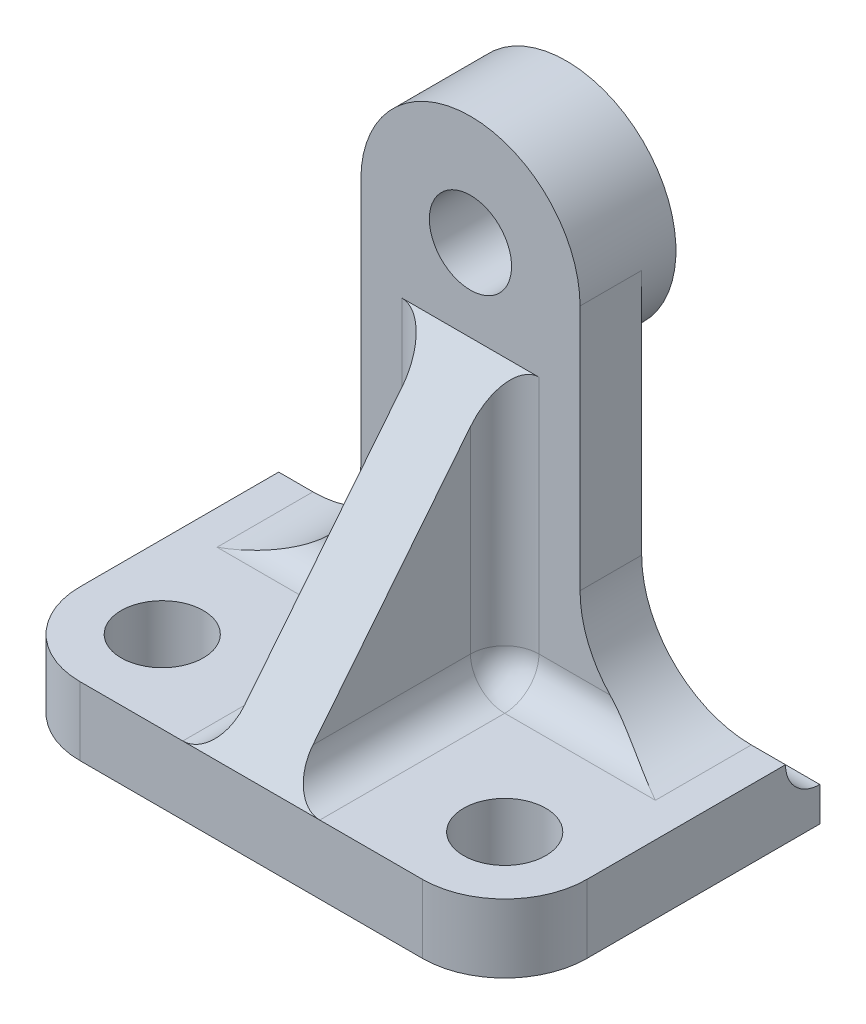
ISO-10303-21;
HEADER;
FILE_DESCRIPTION(('STEP AP214'),'2;1');
FILE_NAME('part.step','',(''),(''),'','','');
FILE_SCHEMA(('AUTOMOTIVE_DESIGN { 1 0 10303 214 1 1 1 1 }'));
ENDSEC;
DATA;
#1=APPLICATION_CONTEXT('core data for automotive mechanical design processes');
#2=APPLICATION_PROTOCOL_DEFINITION('international standard','automotive_design',2000,#1);
#3=PRODUCT_CONTEXT('',#1,'mechanical');
#4=PRODUCT('Part','Part','',(#3));
#5=PRODUCT_RELATED_PRODUCT_CATEGORY('part','',(#4));
#6=PRODUCT_DEFINITION_FORMATION('','',#4);
#7=PRODUCT_DEFINITION_CONTEXT('part definition',#1,'design');
#8=PRODUCT_DEFINITION('design','',#6,#7);
#9=PRODUCT_DEFINITION_SHAPE('','',#8);
#10=(LENGTH_UNIT() NAMED_UNIT(*) SI_UNIT(.MILLI.,.METRE.));
#11=(NAMED_UNIT(*) PLANE_ANGLE_UNIT() SI_UNIT($,.RADIAN.));
#12=(NAMED_UNIT(*) SI_UNIT($,.STERADIAN.) SOLID_ANGLE_UNIT());
#13=UNCERTAINTY_MEASURE_WITH_UNIT(LENGTH_MEASURE(1.E-05),#10,'distance_accuracy_value','');
#14=(GEOMETRIC_REPRESENTATION_CONTEXT(3) GLOBAL_UNCERTAINTY_ASSIGNED_CONTEXT((#13)) GLOBAL_UNIT_ASSIGNED_CONTEXT((#10,
#11,#12)) REPRESENTATION_CONTEXT('',''));
#15=CARTESIAN_POINT('',(0.,0.,0.));
#16=DIRECTION('',(0.,0.,1.));
#17=DIRECTION('',(1.,0.,0.));
#18=AXIS2_PLACEMENT_3D('',#15,#16,#17);
#19=CARTESIAN_POINT('',(-32.7821930509548,0.,46.));
#20=DIRECTION('',(0.,1.,0.));
#21=DIRECTION('',(0.,0.,1.));
#22=AXIS2_PLACEMENT_3D('',#19,#20,#21);
#23=PLANE('',#22);
#24=CARTESIAN_POINT('',(29.2178069490452,0.,34.));
#25=DIRECTION('',(0.,1.,0.));
#26=DIRECTION('',(0.,0.,1.));
#27=AXIS2_PLACEMENT_3D('',#24,#25,#26);
#28=CIRCLE('',#27,5.99999999999999);
#29=CARTESIAN_POINT('',(29.2178069490452,0.,40.));
#30=VERTEX_POINT('',#29);
#31=EDGE_CURVE('E445',#30,#30,#28,.T.);
#32=ORIENTED_EDGE('',*,*,#31,.F.);
#33=EDGE_LOOP('',(#32));
#34=FACE_BOUND('',#33,.T.);
#35=DIRECTION('',(1.,0.,0.));
#36=VECTOR('',#35,1.);
#37=CARTESIAN_POINT('',(-32.7821930509548,0.,19.));
#38=LINE('',#37,#36);
#39=CARTESIAN_POINT('',(36.2178069490452,0.,19.));
#40=VERTEX_POINT('',#39);
#41=CARTESIAN_POINT('',(14.2178069490452,0.,19.));
#42=VERTEX_POINT('',#41);
#43=EDGE_CURVE('E308',#40,#42,#38,.F.);
#44=ORIENTED_EDGE('',*,*,#43,.T.);
#45=DIRECTION('',(0.,0.,1.));
#46=VECTOR('',#45,1.);
#47=CARTESIAN_POINT('',(14.2178069490452,0.,46.));
#48=LINE('',#47,#46);
#49=CARTESIAN_POINT('',(14.2178069490452,0.,46.));
#50=VERTEX_POINT('',#49);
#51=EDGE_CURVE('E398',#42,#50,#48,.T.);
#52=ORIENTED_EDGE('',*,*,#51,.T.);
#53=DIRECTION('',(1.,0.,0.));
#54=VECTOR('',#53,1.);
#55=CARTESIAN_POINT('',(-32.7821930509548,0.,46.));
#56=LINE('',#55,#54);
#57=CARTESIAN_POINT('',(29.2178069490452,0.,46.));
#58=VERTEX_POINT('',#57);
#59=EDGE_CURVE('E242',#50,#58,#56,.T.);
#60=ORIENTED_EDGE('',*,*,#59,.T.);
#61=CARTESIAN_POINT('',(29.2178069490452,0.,34.));
#62=DIRECTION('',(0.,1.,0.));
#63=DIRECTION('',(0.,0.,1.));
#64=AXIS2_PLACEMENT_3D('',#61,#62,#63);
#65=CIRCLE('',#64,12.);
#66=CARTESIAN_POINT('',(41.2178069490452,0.,34.));
#67=VERTEX_POINT('',#66);
#68=EDGE_CURVE('E296',#58,#67,#65,.T.);
#69=ORIENTED_EDGE('',*,*,#68,.T.);
#70=DIRECTION('',(0.,0.,-1.));
#71=VECTOR('',#70,1.);
#72=CARTESIAN_POINT('',(41.2178069490452,0.,46.));
#73=LINE('',#72,#71);
#74=CARTESIAN_POINT('',(41.2178069490452,0.,5.));
#75=VERTEX_POINT('',#74);
#76=EDGE_CURVE('E259',#67,#75,#73,.T.);
#77=ORIENTED_EDGE('',*,*,#76,.T.);
#78=DIRECTION('',(1.,0.,0.));
#79=VECTOR('',#78,1.);
#80=CARTESIAN_POINT('',(-142.412252797358,0.,5.));
#81=LINE('',#80,#79);
#82=CARTESIAN_POINT('',(36.2178069490452,0.,5.));
#83=VERTEX_POINT('',#82);
#84=EDGE_CURVE('E217',#83,#75,#81,.T.);
#85=ORIENTED_EDGE('',*,*,#84,.F.);
#86=DIRECTION('',(0.,0.,-1.));
#87=VECTOR('',#86,1.);
#88=CARTESIAN_POINT('',(36.2178069490452,0.,46.));
#89=LINE('',#88,#87);
#90=EDGE_CURVE('E312',#83,#40,#89,.F.);
#91=ORIENTED_EDGE('',*,*,#90,.T.);
#92=EDGE_LOOP('',(#44,#52,#60,#69,#77,#85,#91));
#93=FACE_BOUND('',#92,.T.);
#94=ADVANCED_FACE('F41',(#34,#93),#23,.T.);
#95=CARTESIAN_POINT('',(4.21780694904517,5.,19.));
#96=DIRECTION('',(1.,0.,0.));
#97=DIRECTION('',(0.,0.,-1.));
#98=AXIS2_PLACEMENT_3D('',#95,#96,#97);
#99=CYLINDRICAL_SURFACE('',#98,5.);
#100=DIRECTION('',(1.,0.,0.));
#101=VECTOR('',#100,1.);
#102=CARTESIAN_POINT('',(4.21780694904517,5.,14.));
#103=LINE('',#102,#101);
#104=CARTESIAN_POINT('',(14.2178069490452,5.,14.));
#105=VERTEX_POINT('',#104);
#106=CARTESIAN_POINT('',(24.5988569104229,5.,14.));
#107=VERTEX_POINT('',#106);
#108=EDGE_CURVE('E302',#105,#107,#103,.T.);
#109=ORIENTED_EDGE('',*,*,#108,.F.);
#110=CARTESIAN_POINT('',(14.2178069490452,5.,19.));
#111=DIRECTION('',(1.,0.,0.));
#112=DIRECTION('',(0.,0.,-1.));
#113=AXIS2_PLACEMENT_3D('',#110,#111,#112);
#114=CIRCLE('',#113,5.);
#115=EDGE_CURVE('E386',#105,#42,#114,.F.);
#116=ORIENTED_EDGE('',*,*,#115,.T.);
#117=ORIENTED_EDGE('',*,*,#43,.F.);
#118=CARTESIAN_POINT('',(24.5988569104229,5.,14.));
#119=CARTESIAN_POINT('',(24.6917310787028,4.90189660748427,14.0000035097307));
#120=CARTESIAN_POINT('',(24.7858292298454,4.80499618840884,14.0028868310953));
#121=CARTESIAN_POINT('',(24.9762624928487,4.61378612585042,14.0140181578785));
#122=CARTESIAN_POINT('',(25.0725969605173,4.5194757529574,14.0222646364354));
#123=CARTESIAN_POINT('',(25.3643199415571,4.24100485407283,14.0544153954449));
#124=CARTESIAN_POINT('',(25.5628099715562,4.06090145153284,14.0857342825745));
#125=CARTESIAN_POINT('',(25.9646210211218,3.71415493918822,14.1649258150141));
#126=CARTESIAN_POINT('',(26.1678789594153,3.54740106207625,14.2126398246961));
#127=CARTESIAN_POINT('',(26.5800240909677,3.22574733836465,14.3222965845337));
#128=CARTESIAN_POINT('',(26.7889148570648,3.07085526666085,14.3842485624163));
#129=CARTESIAN_POINT('',(27.3121584244176,2.70206297959647,14.5527547305159));
#130=CARTESIAN_POINT('',(27.6292471366511,2.49529688313721,14.6664819973748));
#131=CARTESIAN_POINT('',(28.2710641457498,2.10791922760679,14.9148052945669));
#132=CARTESIAN_POINT('',(28.5957945486167,1.92731497907073,15.0494071363134));
#133=CARTESIAN_POINT('',(29.2530639091122,1.59064558487841,15.3359250189548));
#134=CARTESIAN_POINT('',(29.585638024757,1.43473415498917,15.4879400872668));
#135=CARTESIAN_POINT('',(30.25526963026,1.14803663063681,15.8049956680228));
#136=CARTESIAN_POINT('',(30.5923269650833,1.0172496697432,15.9700357310161));
#137=CARTESIAN_POINT('',(31.3635708148325,0.747251236742692,16.3572357864108));
#138=CARTESIAN_POINT('',(31.7988518219437,0.615704286066361,16.5825744577809));
#139=CARTESIAN_POINT('',(32.6733398710665,0.391007620732259,17.0446953555417));
#140=CARTESIAN_POINT('',(33.1125483119759,0.297872193612443,17.2814818035224));
#141=CARTESIAN_POINT('',(33.9919738042539,0.149323459884419,17.7615045543701));
#142=CARTESIAN_POINT('',(34.432183724722,0.0937962808305965,18.0047190490937));
#143=CARTESIAN_POINT('',(35.3135552460708,0.0194576790880034,18.4945302094291));
#144=CARTESIAN_POINT('',(35.7547160972101,0.000623747307564851,18.7411247080479));
#145=CARTESIAN_POINT('',(36.2030855921773,5.08166310800808E-06,18.9917705117728));
#146=CARTESIAN_POINT('',(36.2104462935697,2.44708063118757E-09,18.9958852689759));
#147=CARTESIAN_POINT('',(36.2178069490452,0.,19.));
#148=B_SPLINE_CURVE_WITH_KNOTS('',3,(#118,#119,#120,#121,#122,#123,#124,#125,#126,#127,#128,
#129,#130,#131,#132,#133,#134,#135,#136,#137,#138,#139,#140,#141,#142,#143,#144,#145,#146,#147),
.UNSPECIFIED.,.F.,.F.,(4,2,2,2,2,2,2,2,2,2,2,2,2,2,4),(0.,0.405180350888823,0.810245399599311,
1.61871587829457,2.41957433302391,3.22095330079766,4.40493796727036,5.58925284487019,
6.78067269806455,7.97205145714169,9.49275211319863,11.0140178995503,12.5306566665091,
14.0463647738528,14.0716629997255),.UNSPECIFIED.);
#149=EDGE_CURVE('E361',#40,#107,#148,.F.);
#150=ORIENTED_EDGE('',*,*,#149,.T.);
#151=EDGE_LOOP('',(#109,#116,#117,#150));
#152=FACE_BOUND('',#151,.T.);
#153=ADVANCED_FACE('F496',(#152),#99,.F.);
#154=CARTESIAN_POINT('',(-32.7821930509548,0.,46.));
#155=DIRECTION('',(1.,0.,0.));
#156=DIRECTION('',(0.,0.,-1.));
#157=AXIS2_PLACEMENT_3D('',#154,#155,#156);
#158=PLANE('',#157);
#159=DIRECTION('',(0.,0.,-1.));
#160=VECTOR('',#159,1.);
#161=CARTESIAN_POINT('',(-32.7821930509548,0.,46.));
#162=LINE('',#161,#160);
#163=CARTESIAN_POINT('',(-32.7821930509548,0.,34.));
#164=VERTEX_POINT('',#163);
#165=CARTESIAN_POINT('',(-32.7821930509548,0.,5.));
#166=VERTEX_POINT('',#165);
#167=EDGE_CURVE('E247',#164,#166,#162,.T.);
#168=ORIENTED_EDGE('',*,*,#167,.T.);
#169=CARTESIAN_POINT('',(-32.7821930509548,0.,0.));
#170=DIRECTION('',(1.,0.,0.));
#171=DIRECTION('',(0.,0.,-1.));
#172=AXIS2_PLACEMENT_3D('',#169,#170,#171);
#173=CIRCLE('',#172,5.);
#174=CARTESIAN_POINT('',(-32.7821930509548,-5.,0.));
#175=VERTEX_POINT('',#174);
#176=EDGE_CURVE('E234',#166,#175,#173,.T.);
#177=ORIENTED_EDGE('',*,*,#176,.T.);
#178=DIRECTION('',(0.,-1.,0.));
#179=VECTOR('',#178,1.);
#180=CARTESIAN_POINT('',(-32.7821930509548,0.,0.));
#181=LINE('',#180,#179);
#182=CARTESIAN_POINT('',(-32.7821930509548,-10.,0.));
#183=VERTEX_POINT('',#182);
#184=EDGE_CURVE('E238',#175,#183,#181,.T.);
#185=ORIENTED_EDGE('',*,*,#184,.T.);
#186=DIRECTION('',(0.,0.,-1.));
#187=VECTOR('',#186,1.);
#188=CARTESIAN_POINT('',(-32.7821930509548,-10.,46.));
#189=LINE('',#188,#187);
#190=CARTESIAN_POINT('',(-32.7821930509548,-10.,34.));
#191=VERTEX_POINT('',#190);
#192=EDGE_CURVE('E267',#191,#183,#189,.T.);
#193=ORIENTED_EDGE('',*,*,#192,.F.);
#194=DIRECTION('',(0.,-1.,0.));
#195=VECTOR('',#194,1.);
#196=CARTESIAN_POINT('',(-32.7821930509548,0.,34.));
#197=LINE('',#196,#195);
#198=EDGE_CURVE('E278',#191,#164,#197,.F.);
#199=ORIENTED_EDGE('',*,*,#198,.T.);
#200=EDGE_LOOP('',(#168,#177,#185,#193,#199));
#201=FACE_BOUND('',#200,.T.);
#202=ADVANCED_FACE('F503',(#201),#158,.F.);
#203=CARTESIAN_POINT('',(-32.7821930509548,-10.,46.));
#204=DIRECTION('',(0.,1.,0.));
#205=DIRECTION('',(0.,0.,1.));
#206=AXIS2_PLACEMENT_3D('',#203,#204,#205);
#207=PLANE('',#206);
#208=CARTESIAN_POINT('',(-20.7821930509548,-10.,34.));
#209=DIRECTION('',(0.,1.,0.));
#210=DIRECTION('',(0.,0.,1.));
#211=AXIS2_PLACEMENT_3D('',#208,#209,#210);
#212=CIRCLE('',#211,6.);
#213=CARTESIAN_POINT('',(-20.7821930509548,-10.,40.));
#214=VERTEX_POINT('',#213);
#215=EDGE_CURVE('E424',#214,#214,#212,.T.);
#216=ORIENTED_EDGE('',*,*,#215,.T.);
#217=EDGE_LOOP('',(#216));
#218=FACE_BOUND('',#217,.T.);
#219=CARTESIAN_POINT('',(29.2178069490452,-10.,34.));
#220=DIRECTION('',(0.,1.,0.));
#221=DIRECTION('',(0.,0.,1.));
#222=AXIS2_PLACEMENT_3D('',#219,#220,#221);
#223=CIRCLE('',#222,5.99999999999999);
#224=CARTESIAN_POINT('',(29.2178069490452,-10.,40.));
#225=VERTEX_POINT('',#224);
#226=EDGE_CURVE('E439',#225,#225,#223,.T.);
#227=ORIENTED_EDGE('',*,*,#226,.T.);
#228=EDGE_LOOP('',(#227));
#229=FACE_BOUND('',#228,.T.);
#230=DIRECTION('',(1.,0.,0.));
#231=VECTOR('',#230,1.);
#232=CARTESIAN_POINT('',(-32.7821930509548,-10.,0.));
#233=LINE('',#232,#231);
#234=CARTESIAN_POINT('',(41.2178069490452,-10.,0.));
#235=VERTEX_POINT('',#234);
#236=EDGE_CURVE('E250',#183,#235,#233,.T.);
#237=ORIENTED_EDGE('',*,*,#236,.T.);
#238=DIRECTION('',(0.,0.,-1.));
#239=VECTOR('',#238,1.);
#240=CARTESIAN_POINT('',(41.2178069490452,-10.,46.));
#241=LINE('',#240,#239);
#242=CARTESIAN_POINT('',(41.2178069490452,-10.,34.));
#243=VERTEX_POINT('',#242);
#244=EDGE_CURVE('E263',#243,#235,#241,.T.);
#245=ORIENTED_EDGE('',*,*,#244,.F.);
#246=CARTESIAN_POINT('',(29.2178069490452,-10.,34.));
#247=DIRECTION('',(0.,1.,0.));
#248=DIRECTION('',(0.,0.,1.));
#249=AXIS2_PLACEMENT_3D('',#246,#247,#248);
#250=CIRCLE('',#249,12.);
#251=CARTESIAN_POINT('',(29.2178069490452,-10.,46.));
#252=VERTEX_POINT('',#251);
#253=EDGE_CURVE('E288',#243,#252,#250,.F.);
#254=ORIENTED_EDGE('',*,*,#253,.T.);
#255=DIRECTION('',(1.,0.,0.));
#256=VECTOR('',#255,1.);
#257=CARTESIAN_POINT('',(-32.7821930509548,-10.,46.));
#258=LINE('',#257,#256);
#259=CARTESIAN_POINT('',(-20.7821930509548,-10.,46.));
#260=VERTEX_POINT('',#259);
#261=EDGE_CURVE('E239',#260,#252,#258,.T.);
#262=ORIENTED_EDGE('',*,*,#261,.F.);
#263=CARTESIAN_POINT('',(-20.7821930509548,-10.,34.));
#264=DIRECTION('',(0.,1.,0.));
#265=DIRECTION('',(0.,0.,1.));
#266=AXIS2_PLACEMENT_3D('',#263,#264,#265);
#267=CIRCLE('',#266,12.);
#268=EDGE_CURVE('E275',#260,#191,#267,.F.);
#269=ORIENTED_EDGE('',*,*,#268,.T.);
#270=ORIENTED_EDGE('',*,*,#192,.T.);
#271=EDGE_LOOP('',(#237,#245,#254,#262,#269,#270));
#272=FACE_BOUND('',#271,.T.);
#273=ADVANCED_FACE('F519',(#218,#229,#272),#207,.F.);
#274=CARTESIAN_POINT('',(41.2178069490452,0.,46.));
#275=DIRECTION('',(1.,0.,0.));
#276=DIRECTION('',(0.,1.,0.));
#277=AXIS2_PLACEMENT_3D('',#274,#275,#276);
#278=PLANE('',#277);
#279=CARTESIAN_POINT('',(41.2178069490452,0.,0.));
#280=DIRECTION('',(1.,0.,0.));
#281=DIRECTION('',(0.,1.,0.));
#282=AXIS2_PLACEMENT_3D('',#279,#280,#281);
#283=CIRCLE('',#282,5.);
#284=CARTESIAN_POINT('',(41.2178069490452,-5.,0.));
#285=VERTEX_POINT('',#284);
#286=EDGE_CURVE('E230',#75,#285,#283,.T.);
#287=ORIENTED_EDGE('',*,*,#286,.F.);
#288=ORIENTED_EDGE('',*,*,#76,.F.);
#289=DIRECTION('',(0.,-1.,0.));
#290=VECTOR('',#289,1.);
#291=CARTESIAN_POINT('',(41.2178069490452,0.,34.));
#292=LINE('',#291,#290);
#293=EDGE_CURVE('E284',#67,#243,#292,.T.);
#294=ORIENTED_EDGE('',*,*,#293,.T.);
#295=ORIENTED_EDGE('',*,*,#244,.T.);
#296=DIRECTION('',(0.,-1.,0.));
#297=VECTOR('',#296,1.);
#298=CARTESIAN_POINT('',(41.2178069490452,0.,0.));
#299=LINE('',#298,#297);
#300=EDGE_CURVE('E243',#285,#235,#299,.T.);
#301=ORIENTED_EDGE('',*,*,#300,.F.);
#302=EDGE_LOOP('',(#287,#288,#294,#295,#301));
#303=FACE_BOUND('',#302,.T.);
#304=ADVANCED_FACE('F511',(#303),#278,.T.);
#305=CARTESIAN_POINT('',(-20.7821930509548,0.,34.));
#306=DIRECTION('',(0.,1.,0.));
#307=DIRECTION('',(0.,0.,1.));
#308=AXIS2_PLACEMENT_3D('',#305,#306,#307);
#309=CIRCLE('',#308,6.);
#310=CARTESIAN_POINT('',(-20.7821930509548,0.,40.));
#311=VERTEX_POINT('',#310);
#312=EDGE_CURVE('E433',#311,#311,#309,.T.);
#313=ORIENTED_EDGE('',*,*,#312,.F.);
#314=EDGE_LOOP('',(#313));
#315=FACE_BOUND('',#314,.T.);
#316=CARTESIAN_POINT('',(-20.7821930509548,0.,46.));
#317=VERTEX_POINT('',#316);
#318=CARTESIAN_POINT('',(-5.78219305095481,0.,46.));
#319=VERTEX_POINT('',#318);
#320=EDGE_CURVE('E244',#317,#319,#56,.T.);
#321=ORIENTED_EDGE('',*,*,#320,.T.);
#322=DIRECTION('',(0.,0.,1.));
#323=VECTOR('',#322,1.);
#324=CARTESIAN_POINT('',(-5.78219305095481,0.,19.));
#325=LINE('',#324,#323);
#326=CARTESIAN_POINT('',(-5.78219305095481,0.,19.));
#327=VERTEX_POINT('',#326);
#328=EDGE_CURVE('E401',#319,#327,#325,.F.);
#329=ORIENTED_EDGE('',*,*,#328,.T.);
#330=CARTESIAN_POINT('',(-27.7821930509548,0.,19.));
#331=VERTEX_POINT('',#330);
#332=EDGE_CURVE('E307',#327,#331,#38,.F.);
#333=ORIENTED_EDGE('',*,*,#332,.T.);
#334=DIRECTION('',(0.,0.,-1.));
#335=VECTOR('',#334,1.);
#336=CARTESIAN_POINT('',(-27.7821930509548,0.,46.));
#337=LINE('',#336,#335);
#338=CARTESIAN_POINT('',(-27.7821930509548,0.,5.));
#339=VERTEX_POINT('',#338);
#340=EDGE_CURVE('E316',#331,#339,#337,.T.);
#341=ORIENTED_EDGE('',*,*,#340,.T.);
#342=EDGE_CURVE('E223',#166,#339,#81,.T.);
#343=ORIENTED_EDGE('',*,*,#342,.F.);
#344=ORIENTED_EDGE('',*,*,#167,.F.);
#345=CARTESIAN_POINT('',(-20.7821930509548,0.,34.));
#346=DIRECTION('',(0.,1.,0.));
#347=DIRECTION('',(0.,0.,1.));
#348=AXIS2_PLACEMENT_3D('',#345,#346,#347);
#349=CIRCLE('',#348,12.);
#350=EDGE_CURVE('E281',#164,#317,#349,.T.);
#351=ORIENTED_EDGE('',*,*,#350,.T.);
#352=EDGE_LOOP('',(#321,#329,#333,#341,#343,#344,#351));
#353=FACE_BOUND('',#352,.T.);
#354=ADVANCED_FACE('F499',(#315,#353),#23,.T.);
#355=CARTESIAN_POINT('',(0.,0.,46.));
#356=DIRECTION('',(0.,0.,1.));
#357=DIRECTION('',(1.,0.,0.));
#358=AXIS2_PLACEMENT_3D('',#355,#356,#357);
#359=PLANE('',#358);
#360=ORIENTED_EDGE('',*,*,#261,.T.);
#361=DIRECTION('',(0.,-1.,0.));
#362=VECTOR('',#361,1.);
#363=CARTESIAN_POINT('',(29.2178069490452,0.,46.));
#364=LINE('',#363,#362);
#365=EDGE_CURVE('E292',#252,#58,#364,.F.);
#366=ORIENTED_EDGE('',*,*,#365,.T.);
#367=ORIENTED_EDGE('',*,*,#59,.F.);
#368=DIRECTION('',(1.,0.,0.));
#369=VECTOR('',#368,1.);
#370=CARTESIAN_POINT('',(0.,0.,46.));
#371=LINE('',#370,#369);
#372=EDGE_CURVE('E59',#50,#319,#371,.F.);
#373=ORIENTED_EDGE('',*,*,#372,.T.);
#374=ORIENTED_EDGE('',*,*,#320,.F.);
#375=DIRECTION('',(0.,-1.,0.));
#376=VECTOR('',#375,1.);
#377=CARTESIAN_POINT('',(-20.7821930509548,-10.,46.));
#378=LINE('',#377,#376);
#379=EDGE_CURVE('E271',#317,#260,#378,.T.);
#380=ORIENTED_EDGE('',*,*,#379,.T.);
#381=EDGE_LOOP('',(#360,#366,#367,#373,#374,#380));
#382=FACE_BOUND('',#381,.T.);
#383=ADVANCED_FACE('F510',(#382),#359,.T.);
#384=CARTESIAN_POINT('',(0.,0.,0.));
#385=DIRECTION('',(0.,0.,1.));
#386=DIRECTION('',(1.,0.,0.));
#387=AXIS2_PLACEMENT_3D('',#384,#385,#386);
#388=PLANE('',#387);
#389=DIRECTION('',(1.,0.,0.));
#390=VECTOR('',#389,1.);
#391=CARTESIAN_POINT('',(-142.412252797358,-5.,0.));
#392=LINE('',#391,#390);
#393=EDGE_CURVE('E299',#175,#285,#392,.T.);
#394=ORIENTED_EDGE('',*,*,#393,.T.);
#395=ORIENTED_EDGE('',*,*,#300,.T.);
#396=ORIENTED_EDGE('',*,*,#236,.F.);
#397=ORIENTED_EDGE('',*,*,#184,.F.);
#398=EDGE_LOOP('',(#394,#395,#396,#397));
#399=FACE_BOUND('',#398,.T.);
#400=ADVANCED_FACE('F517',(#399),#388,.F.);
#401=CARTESIAN_POINT('',(-20.7821930509548,0.,34.));
#402=DIRECTION('',(0.,1.,0.));
#403=DIRECTION('',(0.,0.,1.));
#404=AXIS2_PLACEMENT_3D('',#401,#402,#403);
#405=CYLINDRICAL_SURFACE('',#404,12.);
#406=ORIENTED_EDGE('',*,*,#350,.F.);
#407=ORIENTED_EDGE('',*,*,#198,.F.);
#408=ORIENTED_EDGE('',*,*,#268,.F.);
#409=ORIENTED_EDGE('',*,*,#379,.F.);
#410=EDGE_LOOP('',(#406,#407,#408,#409));
#411=FACE_BOUND('',#410,.T.);
#412=ADVANCED_FACE('F556',(#411),#405,.T.);
#413=CARTESIAN_POINT('',(29.2178069490452,0.,34.));
#414=DIRECTION('',(0.,-1.,0.));
#415=DIRECTION('',(1.,0.,0.));
#416=AXIS2_PLACEMENT_3D('',#413,#414,#415);
#417=CYLINDRICAL_SURFACE('',#416,12.);
#418=ORIENTED_EDGE('',*,*,#68,.F.);
#419=ORIENTED_EDGE('',*,*,#365,.F.);
#420=ORIENTED_EDGE('',*,*,#253,.F.);
#421=ORIENTED_EDGE('',*,*,#293,.F.);
#422=EDGE_LOOP('',(#418,#419,#420,#421));
#423=FACE_BOUND('',#422,.T.);
#424=ADVANCED_FACE('F561',(#423),#417,.T.);
#425=CARTESIAN_POINT('',(-142.412252797358,0.,0.));
#426=DIRECTION('',(1.,0.,0.));
#427=DIRECTION('',(0.,0.,-1.));
#428=AXIS2_PLACEMENT_3D('',#425,#426,#427);
#429=CYLINDRICAL_SURFACE('',#428,5.);
#430=EDGE_CURVE('E221',#339,#83,#81,.T.);
#431=ORIENTED_EDGE('',*,*,#430,.T.);
#432=ORIENTED_EDGE('',*,*,#84,.T.);
#433=ORIENTED_EDGE('',*,*,#286,.T.);
#434=ORIENTED_EDGE('',*,*,#393,.F.);
#435=ORIENTED_EDGE('',*,*,#176,.F.);
#436=ORIENTED_EDGE('',*,*,#342,.T.);
#437=EDGE_LOOP('',(#431,#432,#433,#434,#435,#436));
#438=FACE_BOUND('',#437,.T.);
#439=ADVANCED_FACE('F490',(#438),#429,.F.);
#440=CARTESIAN_POINT('',(4.21780694904517,52.,14.));
#441=DIRECTION('',(0.,0.,-1.));
#442=DIRECTION('',(-1.,0.,0.));
#443=AXIS2_PLACEMENT_3D('',#440,#441,#442);
#444=PLANE('',#443);
#445=CARTESIAN_POINT('',(4.21780694904517,52.,14.));
#446=DIRECTION('',(0.,0.,-1.));
#447=DIRECTION('',(-1.,0.,0.));
#448=AXIS2_PLACEMENT_3D('',#445,#446,#447);
#449=CIRCLE('',#448,6.);
#450=CARTESIAN_POINT('',(-1.78219305095483,52.,14.));
#451=VERTEX_POINT('',#450);
#452=EDGE_CURVE('E210',#451,#451,#449,.T.);
#453=ORIENTED_EDGE('',*,*,#452,.T.);
#454=EDGE_LOOP('',(#453));
#455=FACE_BOUND('',#454,.T.);
#456=DIRECTION('',(-1.,0.,0.));
#457=VECTOR('',#456,1.);
#458=CARTESIAN_POINT('',(4.21780694904517,40.,14.));
#459=LINE('',#458,#457);
#460=CARTESIAN_POINT('',(-5.78219305095481,40.,14.));
#461=VERTEX_POINT('',#460);
#462=CARTESIAN_POINT('',(14.2178069490452,40.,14.));
#463=VERTEX_POINT('',#462);
#464=EDGE_CURVE('E453',#461,#463,#459,.F.);
#465=ORIENTED_EDGE('',*,*,#464,.T.);
#466=DIRECTION('',(0.,1.,0.));
#467=VECTOR('',#466,1.);
#468=CARTESIAN_POINT('',(14.2178069490452,5.,14.));
#469=LINE('',#468,#467);
#470=EDGE_CURVE('E383',#463,#105,#469,.F.);
#471=ORIENTED_EDGE('',*,*,#470,.T.);
#472=ORIENTED_EDGE('',*,*,#108,.T.);
#473=CARTESIAN_POINT('',(36.2178069490452,16.,14.));
#474=DIRECTION('',(0.,0.,-1.));
#475=DIRECTION('',(-1.,0.,0.));
#476=AXIS2_PLACEMENT_3D('',#473,#474,#475);
#477=CIRCLE('',#476,16.);
#478=CARTESIAN_POINT('',(20.2178069490452,16.,14.));
#479=VERTEX_POINT('',#478);
#480=EDGE_CURVE('E369',#107,#479,#477,.T.);
#481=ORIENTED_EDGE('',*,*,#480,.T.);
#482=DIRECTION('',(0.,1.,0.));
#483=VECTOR('',#482,1.);
#484=CARTESIAN_POINT('',(20.2178069490452,0.,14.));
#485=LINE('',#484,#483);
#486=CARTESIAN_POINT('',(20.2178069490452,52.,14.));
#487=VERTEX_POINT('',#486);
#488=EDGE_CURVE('E224',#479,#487,#485,.T.);
#489=ORIENTED_EDGE('',*,*,#488,.T.);
#490=CARTESIAN_POINT('',(4.21780694904517,52.,14.));
#491=DIRECTION('',(0.,0.,1.));
#492=DIRECTION('',(-1.,0.,0.));
#493=AXIS2_PLACEMENT_3D('',#490,#491,#492);
#494=CIRCLE('',#493,16.);
#495=CARTESIAN_POINT('',(-11.7821930509548,52.,14.));
#496=VERTEX_POINT('',#495);
#497=EDGE_CURVE('E470',#487,#496,#494,.T.);
#498=ORIENTED_EDGE('',*,*,#497,.T.);
#499=DIRECTION('',(0.,-1.,0.));
#500=VECTOR('',#499,1.);
#501=CARTESIAN_POINT('',(-11.7821930509548,0.,14.));
#502=LINE('',#501,#500);
#503=CARTESIAN_POINT('',(-11.7821930509548,16.,14.));
#504=VERTEX_POINT('',#503);
#505=EDGE_CURVE('E214',#496,#504,#502,.T.);
#506=ORIENTED_EDGE('',*,*,#505,.T.);
#507=CARTESIAN_POINT('',(-27.7821930509548,16.,14.));
#508=DIRECTION('',(0.,0.,-1.));
#509=DIRECTION('',(-1.,0.,0.));
#510=AXIS2_PLACEMENT_3D('',#507,#508,#509);
#511=CIRCLE('',#510,16.);
#512=CARTESIAN_POINT('',(-16.1632430123326,5.,14.));
#513=VERTEX_POINT('',#512);
#514=EDGE_CURVE('E329',#504,#513,#511,.T.);
#515=ORIENTED_EDGE('',*,*,#514,.T.);
#516=CARTESIAN_POINT('',(-5.78219305095481,5.,14.));
#517=VERTEX_POINT('',#516);
#518=EDGE_CURVE('E303',#513,#517,#103,.T.);
#519=ORIENTED_EDGE('',*,*,#518,.T.);
#520=DIRECTION('',(0.,1.,0.));
#521=VECTOR('',#520,1.);
#522=CARTESIAN_POINT('',(-5.78219305095481,52.,14.));
#523=LINE('',#522,#521);
#524=EDGE_CURVE('E379',#517,#461,#523,.T.);
#525=ORIENTED_EDGE('',*,*,#524,.T.);
#526=EDGE_LOOP('',(#465,#471,#472,#481,#489,#498,#506,#515,#519,#525));
#527=FACE_BOUND('',#526,.T.);
#528=ADVANCED_FACE('F482',(#455,#527),#444,.F.);
#529=CARTESIAN_POINT('',(4.21780694904517,52.,0.));
#530=DIRECTION('',(0.,0.,-1.));
#531=DIRECTION('',(-1.,0.,0.));
#532=AXIS2_PLACEMENT_3D('',#529,#530,#531);
#533=PLANE('',#532);
#534=CARTESIAN_POINT('',(4.21780694904517,52.,0.));
#535=DIRECTION('',(0.,0.,-1.));
#536=DIRECTION('',(-1.,0.,0.));
#537=AXIS2_PLACEMENT_3D('',#534,#535,#536);
#538=CIRCLE('',#537,6.);
#539=CARTESIAN_POINT('',(-1.78219305095483,52.,0.));
#540=VERTEX_POINT('',#539);
#541=EDGE_CURVE('E461',#540,#540,#538,.T.);
#542=ORIENTED_EDGE('',*,*,#541,.F.);
#543=EDGE_LOOP('',(#542));
#544=FACE_BOUND('',#543,.T.);
#545=CARTESIAN_POINT('',(4.21780694904517,52.,0.));
#546=DIRECTION('',(0.,0.,1.));
#547=DIRECTION('',(-1.,0.,0.));
#548=AXIS2_PLACEMENT_3D('',#545,#546,#547);
#549=CIRCLE('',#548,16.);
#550=CARTESIAN_POINT('',(-11.7821930509548,52.,0.));
#551=VERTEX_POINT('',#550);
#552=EDGE_CURVE('E197',#551,#551,#549,.T.);
#553=ORIENTED_EDGE('',*,*,#552,.F.);
#554=EDGE_LOOP('',(#553));
#555=FACE_BOUND('',#554,.T.);
#556=ADVANCED_FACE('F480',(#544,#555),#533,.T.);
#557=CARTESIAN_POINT('',(4.21780694904517,52.,14.));
#558=DIRECTION('',(0.,0.,-1.));
#559=DIRECTION('',(-1.,0.,0.));
#560=AXIS2_PLACEMENT_3D('',#557,#558,#559);
#561=CYLINDRICAL_SURFACE('',#560,16.);
#562=DIRECTION('',(0.,0.,-1.));
#563=VECTOR('',#562,1.);
#564=CARTESIAN_POINT('',(20.2178069490452,52.,14.));
#565=LINE('',#564,#563);
#566=CARTESIAN_POINT('',(20.2178069490452,52.,5.));
#567=VERTEX_POINT('',#566);
#568=EDGE_CURVE('E208',#487,#567,#565,.T.);
#569=ORIENTED_EDGE('',*,*,#568,.T.);
#570=CARTESIAN_POINT('',(4.21780694904517,52.,5.));
#571=DIRECTION('',(0.,0.,1.));
#572=DIRECTION('',(0.,-1.,0.));
#573=AXIS2_PLACEMENT_3D('',#570,#571,#572);
#574=CIRCLE('',#573,16.);
#575=CARTESIAN_POINT('',(-11.7821930509548,52.,5.));
#576=VERTEX_POINT('',#575);
#577=EDGE_CURVE('E189',#576,#567,#574,.T.);
#578=ORIENTED_EDGE('',*,*,#577,.F.);
#579=DIRECTION('',(0.,0.,-1.));
#580=VECTOR('',#579,1.);
#581=CARTESIAN_POINT('',(-11.7821930509548,52.,14.));
#582=LINE('',#581,#580);
#583=EDGE_CURVE('E206',#496,#576,#582,.T.);
#584=ORIENTED_EDGE('',*,*,#583,.F.);
#585=ORIENTED_EDGE('',*,*,#497,.F.);
#586=EDGE_LOOP('',(#569,#578,#584,#585));
#587=FACE_BOUND('',#586,.T.);
#588=ORIENTED_EDGE('',*,*,#552,.T.);
#589=EDGE_LOOP('',(#588));
#590=FACE_BOUND('',#589,.T.);
#591=ADVANCED_FACE('F203',(#587,#590),#561,.T.);
#592=CARTESIAN_POINT('',(-11.7821930509548,0.,14.));
#593=DIRECTION('',(1.,0.,0.));
#594=DIRECTION('',(0.,0.,-1.));
#595=AXIS2_PLACEMENT_3D('',#592,#593,#594);
#596=PLANE('',#595);
#597=DIRECTION('',(0.,1.,0.));
#598=VECTOR('',#597,1.);
#599=CARTESIAN_POINT('',(-11.7821930509548,52.,5.));
#600=LINE('',#599,#598);
#601=CARTESIAN_POINT('',(-11.7821930509548,16.,5.));
#602=VERTEX_POINT('',#601);
#603=EDGE_CURVE('E185',#602,#576,#600,.T.);
#604=ORIENTED_EDGE('',*,*,#603,.F.);
#605=DIRECTION('',(0.,0.,-1.));
#606=VECTOR('',#605,1.);
#607=CARTESIAN_POINT('',(-11.7821930509548,16.,14.));
#608=LINE('',#607,#606);
#609=EDGE_CURVE('E320',#602,#504,#608,.F.);
#610=ORIENTED_EDGE('',*,*,#609,.T.);
#611=ORIENTED_EDGE('',*,*,#505,.F.);
#612=ORIENTED_EDGE('',*,*,#583,.T.);
#613=EDGE_LOOP('',(#604,#610,#611,#612));
#614=FACE_BOUND('',#613,.T.);
#615=ADVANCED_FACE('F212',(#614),#596,.F.);
#616=CARTESIAN_POINT('',(20.2178069490452,0.,14.));
#617=DIRECTION('',(-1.,0.,0.));
#618=DIRECTION('',(0.,0.,1.));
#619=AXIS2_PLACEMENT_3D('',#616,#617,#618);
#620=PLANE('',#619);
#621=ORIENTED_EDGE('',*,*,#488,.F.);
#622=DIRECTION('',(0.,0.,-1.));
#623=VECTOR('',#622,1.);
#624=CARTESIAN_POINT('',(20.2178069490452,16.,14.));
#625=LINE('',#624,#623);
#626=CARTESIAN_POINT('',(20.2178069490452,16.,5.));
#627=VERTEX_POINT('',#626);
#628=EDGE_CURVE('E323',#479,#627,#625,.T.);
#629=ORIENTED_EDGE('',*,*,#628,.T.);
#630=DIRECTION('',(0.,-1.,0.));
#631=VECTOR('',#630,1.);
#632=CARTESIAN_POINT('',(20.2178069490452,52.,5.));
#633=LINE('',#632,#631);
#634=EDGE_CURVE('E198',#567,#627,#633,.T.);
#635=ORIENTED_EDGE('',*,*,#634,.F.);
#636=ORIENTED_EDGE('',*,*,#568,.F.);
#637=EDGE_LOOP('',(#621,#629,#635,#636));
#638=FACE_BOUND('',#637,.T.);
#639=ADVANCED_FACE('F596',(#638),#620,.F.);
#640=CARTESIAN_POINT('',(41.2188069490452,52.,5.));
#641=DIRECTION('',(0.,0.,1.));
#642=DIRECTION('',(0.,-1.,0.));
#643=AXIS2_PLACEMENT_3D('',#640,#641,#642);
#644=PLANE('',#643);
#645=ORIENTED_EDGE('',*,*,#577,.T.);
#646=ORIENTED_EDGE('',*,*,#634,.T.);
#647=CARTESIAN_POINT('',(36.2178069490452,16.,5.));
#648=DIRECTION('',(0.,0.,1.));
#649=DIRECTION('',(0.,-1.,0.));
#650=AXIS2_PLACEMENT_3D('',#647,#648,#649);
#651=CIRCLE('',#650,16.);
#652=EDGE_CURVE('E343',#627,#83,#651,.T.);
#653=ORIENTED_EDGE('',*,*,#652,.T.);
#654=ORIENTED_EDGE('',*,*,#430,.F.);
#655=CARTESIAN_POINT('',(-27.7821930509548,16.,5.));
#656=DIRECTION('',(0.,0.,1.));
#657=DIRECTION('',(0.,-1.,0.));
#658=AXIS2_PLACEMENT_3D('',#655,#656,#657);
#659=CIRCLE('',#658,16.);
#660=EDGE_CURVE('E192',#339,#602,#659,.T.);
#661=ORIENTED_EDGE('',*,*,#660,.T.);
#662=ORIENTED_EDGE('',*,*,#603,.T.);
#663=EDGE_LOOP('',(#645,#646,#653,#654,#661,#662));
#664=FACE_BOUND('',#663,.T.);
#665=ADVANCED_FACE('F187',(#664),#644,.F.);
#666=ORIENTED_EDGE('',*,*,#332,.F.);
#667=CARTESIAN_POINT('',(-5.78219305095481,5.,19.));
#668=DIRECTION('',(1.,0.,0.));
#669=DIRECTION('',(0.,0.,-1.));
#670=AXIS2_PLACEMENT_3D('',#667,#668,#669);
#671=CIRCLE('',#670,5.);
#672=EDGE_CURVE('E395',#327,#517,#671,.T.);
#673=ORIENTED_EDGE('',*,*,#672,.T.);
#674=ORIENTED_EDGE('',*,*,#518,.F.);
#675=CARTESIAN_POINT('',(-16.1632430123326,5.,14.));
#676=CARTESIAN_POINT('',(-16.2561171806124,4.90189660748432,14.0000035097307));
#677=CARTESIAN_POINT('',(-16.350215331755,4.80499618840893,14.0028868310953));
#678=CARTESIAN_POINT('',(-16.5406485947582,4.61378612585061,14.0140181578785));
#679=CARTESIAN_POINT('',(-16.6369830624267,4.51947575295763,14.0222646364354));
#680=CARTESIAN_POINT('',(-16.9287060434664,4.24100485407318,14.0544153954449));
#681=CARTESIAN_POINT('',(-17.1271960734654,4.06090145153328,14.0857342825744));
#682=CARTESIAN_POINT('',(-17.529007123031,3.71415493918864,14.164925815014));
#683=CARTESIAN_POINT('',(-17.7322650613245,3.54740106207659,14.212639824696));
#684=CARTESIAN_POINT('',(-18.1444101928772,3.22574733836481,14.3222965845337));
#685=CARTESIAN_POINT('',(-18.3533009589744,3.07085526666093,14.3842485624163));
#686=CARTESIAN_POINT('',(-18.8765445263273,2.70206297959642,14.5527547305159));
#687=CARTESIAN_POINT('',(-19.1936332385609,2.49529688313711,14.6664819973749));
#688=CARTESIAN_POINT('',(-19.8354502476598,2.10791922760661,14.9148052945671));
#689=CARTESIAN_POINT('',(-20.1601806505267,1.92731497907051,15.0494071363136));
#690=CARTESIAN_POINT('',(-20.8174500110223,1.59064558487822,15.3359250189549));
#691=CARTESIAN_POINT('',(-21.150024126667,1.43473415498903,15.4879400872669));
#692=CARTESIAN_POINT('',(-21.8196557321698,1.14803663063675,15.8049956680229));
#693=CARTESIAN_POINT('',(-22.1567130669931,1.01724966974317,15.9700357310162));
#694=CARTESIAN_POINT('',(-22.9279569167422,0.747251236742695,16.3572357864107));
#695=CARTESIAN_POINT('',(-23.3632379238535,0.615704286066367,16.5825744577807));
#696=CARTESIAN_POINT('',(-24.2377259729759,0.391007620732282,17.0446953555419));
#697=CARTESIAN_POINT('',(-24.6769344138848,0.297872193612475,17.2814818035233));
#698=CARTESIAN_POINT('',(-25.556359906164,0.149323459884447,17.761504554369));
#699=CARTESIAN_POINT('',(-25.9965698266336,0.0937962808306168,18.0047190490899));
#700=CARTESIAN_POINT('',(-26.8779413479783,0.0194576790879975,18.4945302094329));
#701=CARTESIAN_POINT('',(-27.3191021991119,0.000623747307541425,18.741124708062));
#702=CARTESIAN_POINT('',(-27.7674716940867,5.08166310724744E-06,18.9917705117733));
#703=CARTESIAN_POINT('',(-27.7748323954793,2.44708025347607E-09,18.9958852689761));
#704=CARTESIAN_POINT('',(-27.7821930509548,0.,19.));
#705=B_SPLINE_CURVE_WITH_KNOTS('',3,(#675,#676,#677,#678,#679,#680,#681,#682,#683,#684,#685,
#686,#687,#688,#689,#690,#691,#692,#693,#694,#695,#696,#697,#698,#699,#700,#701,#702,#703,#704),
.UNSPECIFIED.,.F.,.F.,(4,2,2,2,2,2,2,2,2,2,2,2,2,2,4),(0.,0.405180350888628,0.810245399598923,
1.61871587829376,2.4195743330235,3.22095330079766,4.40493796727067,5.58925284487077,
6.7806726980648,7.9720514571417,9.4927521131986,11.01401789955,12.530656666509,14.0463647738529,
14.0716629997255),.UNSPECIFIED.);
#706=EDGE_CURVE('E333',#513,#331,#705,.T.);
#707=ORIENTED_EDGE('',*,*,#706,.T.);
#708=EDGE_LOOP('',(#666,#673,#674,#707));
#709=FACE_BOUND('',#708,.T.);
#710=ADVANCED_FACE('F345',(#709),#99,.F.);
#711=CARTESIAN_POINT('',(-27.7821930509548,16.,46.));
#712=DIRECTION('',(0.,0.,-1.));
#713=DIRECTION('',(-1.,0.,0.));
#714=AXIS2_PLACEMENT_3D('',#711,#712,#713);
#715=CYLINDRICAL_SURFACE('',#714,16.);
#716=ORIENTED_EDGE('',*,*,#514,.F.);
#717=ORIENTED_EDGE('',*,*,#609,.F.);
#718=ORIENTED_EDGE('',*,*,#660,.F.);
#719=ORIENTED_EDGE('',*,*,#340,.F.);
#720=ORIENTED_EDGE('',*,*,#706,.F.);
#721=EDGE_LOOP('',(#716,#717,#718,#719,#720));
#722=FACE_BOUND('',#721,.T.);
#723=ADVANCED_FACE('F348',(#722),#715,.F.);
#724=CARTESIAN_POINT('',(36.2178069490452,16.,14.));
#725=DIRECTION('',(0.,0.,-1.));
#726=DIRECTION('',(-1.,0.,0.));
#727=AXIS2_PLACEMENT_3D('',#724,#725,#726);
#728=CYLINDRICAL_SURFACE('',#727,16.);
#729=ORIENTED_EDGE('',*,*,#149,.F.);
#730=ORIENTED_EDGE('',*,*,#90,.F.);
#731=ORIENTED_EDGE('',*,*,#652,.F.);
#732=ORIENTED_EDGE('',*,*,#628,.F.);
#733=ORIENTED_EDGE('',*,*,#480,.F.);
#734=EDGE_LOOP('',(#729,#730,#731,#732,#733));
#735=FACE_BOUND('',#734,.T.);
#736=ADVANCED_FACE('F352',(#735),#728,.F.);
#737=CARTESIAN_POINT('',(4.21780694904517,52.,46.));
#738=DIRECTION('',(0.,0.,-1.));
#739=DIRECTION('',(-1.,0.,0.));
#740=AXIS2_PLACEMENT_3D('',#737,#738,#739);
#741=CYLINDRICAL_SURFACE('',#740,6.);
#742=ORIENTED_EDGE('',*,*,#541,.T.);
#743=EDGE_LOOP('',(#742));
#744=FACE_BOUND('',#743,.T.);
#745=ORIENTED_EDGE('',*,*,#452,.F.);
#746=EDGE_LOOP('',(#745));
#747=FACE_BOUND('',#746,.T.);
#748=ADVANCED_FACE('F357',(#744,#747),#741,.F.);
#749=CARTESIAN_POINT('',(4.21780694904517,40.,14.));
#750=DIRECTION('',(0.,-0.624695047554424,-0.78086880944303));
#751=DIRECTION('',(0.,-0.78086880944303,0.624695047554424));
#752=AXIS2_PLACEMENT_3D('',#749,#750,#751);
#753=PLANE('',#752);
#754=ORIENTED_EDGE('',*,*,#372,.F.);
#755=CARTESIAN_POINT('',(14.2178069490452,5.,42.));
#756=DIRECTION('',(0.,-0.624695047554424,-0.78086880944303));
#757=DIRECTION('',(0.,-0.78086880944303,0.624695047554424));
#758=AXIS2_PLACEMENT_3D('',#755,#756,#757);
#759=ELLIPSE('',#758,6.40312423743285,5.);
#760=CARTESIAN_POINT('',(9.21780694904516,5.,42.));
#761=VERTEX_POINT('',#760);
#762=EDGE_CURVE('E51',#50,#761,#759,.T.);
#763=ORIENTED_EDGE('',*,*,#762,.T.);
#764=DIRECTION('',(0.,-0.78086880944303,0.624695047554424));
#765=VECTOR('',#764,1.);
#766=CARTESIAN_POINT('',(9.21780694904516,40.,14.));
#767=LINE('',#766,#765);
#768=CARTESIAN_POINT('',(9.21780694904516,33.75,19.));
#769=VERTEX_POINT('',#768);
#770=EDGE_CURVE('E420',#769,#761,#767,.T.);
#771=ORIENTED_EDGE('',*,*,#770,.F.);
#772=CARTESIAN_POINT('',(14.2178069490452,33.75,19.));
#773=DIRECTION('',(0.,-0.624695047554424,-0.78086880944303));
#774=DIRECTION('',(0.,-0.78086880944303,0.624695047554424));
#775=AXIS2_PLACEMENT_3D('',#772,#773,#774);
#776=ELLIPSE('',#775,8.00390529679106,5.);
#777=EDGE_CURVE('E404',#769,#463,#776,.T.);
#778=ORIENTED_EDGE('',*,*,#777,.T.);
#779=ORIENTED_EDGE('',*,*,#464,.F.);
#780=CARTESIAN_POINT('',(-5.78219305095481,33.75,19.));
#781=DIRECTION('',(0.,-0.624695047554424,-0.78086880944303));
#782=DIRECTION('',(0.,0.78086880944303,-0.624695047554424));
#783=AXIS2_PLACEMENT_3D('',#780,#781,#782);
#784=ELLIPSE('',#783,8.00390529679106,5.);
#785=CARTESIAN_POINT('',(-0.782193050954811,33.75,19.));
#786=VERTEX_POINT('',#785);
#787=EDGE_CURVE('E408',#461,#786,#784,.T.);
#788=ORIENTED_EDGE('',*,*,#787,.T.);
#789=DIRECTION('',(0.,-0.78086880944303,0.624695047554424));
#790=VECTOR('',#789,1.);
#791=CARTESIAN_POINT('',(-0.782193050954811,40.,14.));
#792=LINE('',#791,#790);
#793=CARTESIAN_POINT('',(-0.782193050954811,5.,42.));
#794=VERTEX_POINT('',#793);
#795=EDGE_CURVE('E449',#786,#794,#792,.T.);
#796=ORIENTED_EDGE('',*,*,#795,.T.);
#797=CARTESIAN_POINT('',(-5.78219305095481,5.,42.));
#798=DIRECTION('',(0.,-0.624695047554424,-0.78086880944303));
#799=DIRECTION('',(0.,0.78086880944303,-0.624695047554424));
#800=AXIS2_PLACEMENT_3D('',#797,#798,#799);
#801=ELLIPSE('',#800,6.40312423743285,5.);
#802=EDGE_CURVE('E11',#794,#319,#801,.T.);
#803=ORIENTED_EDGE('',*,*,#802,.T.);
#804=EDGE_LOOP('',(#754,#763,#771,#778,#779,#788,#796,#803));
#805=FACE_BOUND('',#804,.T.);
#806=ADVANCED_FACE('F529',(#805),#753,.F.);
#807=CARTESIAN_POINT('',(-0.782193050954811,29.,23.));
#808=DIRECTION('',(-1.,0.,0.));
#809=DIRECTION('',(0.,0.,1.));
#810=AXIS2_PLACEMENT_3D('',#807,#808,#809);
#811=PLANE('',#810);
#812=ORIENTED_EDGE('',*,*,#795,.F.);
#813=DIRECTION('',(0.,1.,0.));
#814=VECTOR('',#813,1.);
#815=CARTESIAN_POINT('',(-0.782193050954811,29.,19.));
#816=LINE('',#815,#814);
#817=CARTESIAN_POINT('',(-0.782193050954811,5.,19.));
#818=VERTEX_POINT('',#817);
#819=EDGE_CURVE('E392',#786,#818,#816,.F.);
#820=ORIENTED_EDGE('',*,*,#819,.T.);
#821=DIRECTION('',(0.,0.,1.));
#822=VECTOR('',#821,1.);
#823=CARTESIAN_POINT('',(-0.782193050954811,5.,46.));
#824=LINE('',#823,#822);
#825=EDGE_CURVE('E389',#818,#794,#824,.T.);
#826=ORIENTED_EDGE('',*,*,#825,.T.);
#827=EDGE_LOOP('',(#812,#820,#826));
#828=FACE_BOUND('',#827,.T.);
#829=ADVANCED_FACE('F579',(#828),#811,.T.);
#830=CARTESIAN_POINT('',(9.21780694904516,29.,23.));
#831=DIRECTION('',(-1.,0.,0.));
#832=DIRECTION('',(0.,0.,1.));
#833=AXIS2_PLACEMENT_3D('',#830,#831,#832);
#834=PLANE('',#833);
#835=DIRECTION('',(0.,0.,1.));
#836=VECTOR('',#835,1.);
#837=CARTESIAN_POINT('',(9.21780694904516,5.,23.));
#838=LINE('',#837,#836);
#839=CARTESIAN_POINT('',(9.21780694904516,5.,19.));
#840=VERTEX_POINT('',#839);
#841=EDGE_CURVE('E372',#761,#840,#838,.F.);
#842=ORIENTED_EDGE('',*,*,#841,.T.);
#843=DIRECTION('',(0.,1.,0.));
#844=VECTOR('',#843,1.);
#845=CARTESIAN_POINT('',(9.21780694904516,40.,19.));
#846=LINE('',#845,#844);
#847=EDGE_CURVE('E375',#840,#769,#846,.T.);
#848=ORIENTED_EDGE('',*,*,#847,.T.);
#849=ORIENTED_EDGE('',*,*,#770,.T.);
#850=EDGE_LOOP('',(#842,#848,#849));
#851=FACE_BOUND('',#850,.T.);
#852=ADVANCED_FACE('F571',(#851),#834,.F.);
#853=CARTESIAN_POINT('',(14.2178069490452,5.,46.));
#854=DIRECTION('',(0.,0.,1.));
#855=DIRECTION('',(1.,0.,0.));
#856=AXIS2_PLACEMENT_3D('',#853,#854,#855);
#857=CYLINDRICAL_SURFACE('',#856,5.);
#858=ORIENTED_EDGE('',*,*,#762,.F.);
#859=ORIENTED_EDGE('',*,*,#51,.F.);
#860=CARTESIAN_POINT('',(14.2178069490452,5.,19.));
#861=DIRECTION('',(0.,0.,1.));
#862=DIRECTION('',(1.,0.,0.));
#863=AXIS2_PLACEMENT_3D('',#860,#861,#862);
#864=CIRCLE('',#863,5.);
#865=EDGE_CURVE('E417',#840,#42,#864,.T.);
#866=ORIENTED_EDGE('',*,*,#865,.F.);
#867=ORIENTED_EDGE('',*,*,#841,.F.);
#868=EDGE_LOOP('',(#858,#859,#866,#867));
#869=FACE_BOUND('',#868,.T.);
#870=ADVANCED_FACE('F567',(#869),#857,.F.);
#871=CARTESIAN_POINT('',(14.2178069490452,5.,19.));
#872=DIRECTION('',(-1.,0.,0.));
#873=DIRECTION('',(0.,0.,1.));
#874=AXIS2_PLACEMENT_3D('',#871,#872,#873);
#875=SPHERICAL_SURFACE('',#874,5.);
#876=ORIENTED_EDGE('',*,*,#865,.T.);
#877=ORIENTED_EDGE('',*,*,#115,.F.);
#878=CARTESIAN_POINT('',(14.2178069490452,5.,19.));
#879=DIRECTION('',(0.,-1.,0.));
#880=DIRECTION('',(0.,0.,-1.));
#881=AXIS2_PLACEMENT_3D('',#878,#879,#880);
#882=CIRCLE('',#881,5.);
#883=EDGE_CURVE('E413',#840,#105,#882,.T.);
#884=ORIENTED_EDGE('',*,*,#883,.F.);
#885=EDGE_LOOP('',(#876,#877,#884));
#886=FACE_BOUND('',#885,.T.);
#887=ADVANCED_FACE('F643',(#886),#875,.F.);
#888=CARTESIAN_POINT('',(14.2178069490452,29.,19.));
#889=DIRECTION('',(0.,-1.,0.));
#890=DIRECTION('',(0.,0.,-1.));
#891=AXIS2_PLACEMENT_3D('',#888,#889,#890);
#892=CYLINDRICAL_SURFACE('',#891,5.);
#893=ORIENTED_EDGE('',*,*,#883,.T.);
#894=ORIENTED_EDGE('',*,*,#470,.F.);
#895=ORIENTED_EDGE('',*,*,#777,.F.);
#896=ORIENTED_EDGE('',*,*,#847,.F.);
#897=EDGE_LOOP('',(#893,#894,#895,#896));
#898=FACE_BOUND('',#897,.T.);
#899=ADVANCED_FACE('F359',(#898),#892,.F.);
#900=CARTESIAN_POINT('',(-5.78219305095481,5.,23.));
#901=DIRECTION('',(0.,0.,-1.));
#902=DIRECTION('',(-1.,0.,0.));
#903=AXIS2_PLACEMENT_3D('',#900,#901,#902);
#904=CYLINDRICAL_SURFACE('',#903,5.);
#905=CARTESIAN_POINT('',(-5.78219305095481,5.,19.));
#906=DIRECTION('',(0.,0.,1.));
#907=DIRECTION('',(1.,0.,0.));
#908=AXIS2_PLACEMENT_3D('',#905,#906,#907);
#909=CIRCLE('',#908,5.);
#910=EDGE_CURVE('E45',#327,#818,#909,.T.);
#911=ORIENTED_EDGE('',*,*,#910,.F.);
#912=ORIENTED_EDGE('',*,*,#328,.F.);
#913=ORIENTED_EDGE('',*,*,#802,.F.);
#914=ORIENTED_EDGE('',*,*,#825,.F.);
#915=EDGE_LOOP('',(#911,#912,#913,#914));
#916=FACE_BOUND('',#915,.T.);
#917=ADVANCED_FACE('F43',(#916),#904,.F.);
#918=CARTESIAN_POINT('',(-5.78219305095481,5.,19.));
#919=DIRECTION('',(-1.,0.,0.));
#920=DIRECTION('',(0.,0.,1.));
#921=AXIS2_PLACEMENT_3D('',#918,#919,#920);
#922=SPHERICAL_SURFACE('',#921,5.);
#923=ORIENTED_EDGE('',*,*,#672,.F.);
#924=ORIENTED_EDGE('',*,*,#910,.T.);
#925=CARTESIAN_POINT('',(-5.78219305095481,5.,19.));
#926=DIRECTION('',(0.,-1.,0.));
#927=DIRECTION('',(0.,0.,-1.));
#928=AXIS2_PLACEMENT_3D('',#925,#926,#927);
#929=CIRCLE('',#928,5.);
#930=EDGE_CURVE('E421',#517,#818,#929,.T.);
#931=ORIENTED_EDGE('',*,*,#930,.F.);
#932=EDGE_LOOP('',(#923,#924,#931));
#933=FACE_BOUND('',#932,.T.);
#934=ADVANCED_FACE('F536',(#933),#922,.F.);
#935=CARTESIAN_POINT('',(-5.78219305095481,52.,19.));
#936=DIRECTION('',(0.,1.,0.));
#937=DIRECTION('',(0.,0.,1.));
#938=AXIS2_PLACEMENT_3D('',#935,#936,#937);
#939=CYLINDRICAL_SURFACE('',#938,5.);
#940=ORIENTED_EDGE('',*,*,#930,.T.);
#941=ORIENTED_EDGE('',*,*,#819,.F.);
#942=ORIENTED_EDGE('',*,*,#787,.F.);
#943=ORIENTED_EDGE('',*,*,#524,.F.);
#944=EDGE_LOOP('',(#940,#941,#942,#943));
#945=FACE_BOUND('',#944,.T.);
#946=ADVANCED_FACE('F577',(#945),#939,.F.);
#947=CARTESIAN_POINT('',(-20.7821930509548,-10.,34.));
#948=DIRECTION('',(0.,1.,0.));
#949=DIRECTION('',(0.,0.,1.));
#950=AXIS2_PLACEMENT_3D('',#947,#948,#949);
#951=CYLINDRICAL_SURFACE('',#950,6.);
#952=ORIENTED_EDGE('',*,*,#215,.F.);
#953=EDGE_LOOP('',(#952));
#954=FACE_BOUND('',#953,.T.);
#955=ORIENTED_EDGE('',*,*,#312,.T.);
#956=EDGE_LOOP('',(#955));
#957=FACE_BOUND('',#956,.T.);
#958=ADVANCED_FACE('F628',(#954,#957),#951,.F.);
#959=CARTESIAN_POINT('',(29.2178069490452,-10.,34.));
#960=DIRECTION('',(0.,1.,0.));
#961=DIRECTION('',(0.,0.,1.));
#962=AXIS2_PLACEMENT_3D('',#959,#960,#961);
#963=CYLINDRICAL_SURFACE('',#962,5.99999999999999);
#964=ORIENTED_EDGE('',*,*,#226,.F.);
#965=EDGE_LOOP('',(#964));
#966=FACE_BOUND('',#965,.T.);
#967=ORIENTED_EDGE('',*,*,#31,.T.);
#968=EDGE_LOOP('',(#967));
#969=FACE_BOUND('',#968,.T.);
#970=ADVANCED_FACE('F589',(#966,#969),#963,.F.);
#971=CLOSED_SHELL('',(#94,#153,#202,#273,#304,#354,#383,#400,#412,#424,#439,#528,#556,#591,#615,
#639,#665,#710,#723,#736,#748,#806,#829,#852,#870,#887,#899,#917,#934,#946,#958,#970));
#972=MANIFOLD_SOLID_BREP('B2',#971);
#973=ADVANCED_BREP_SHAPE_REPRESENTATION('',(#18,#972),#14);
#974=SHAPE_DEFINITION_REPRESENTATION(#9,#973);
ENDSEC;
END-ISO-10303-21;
